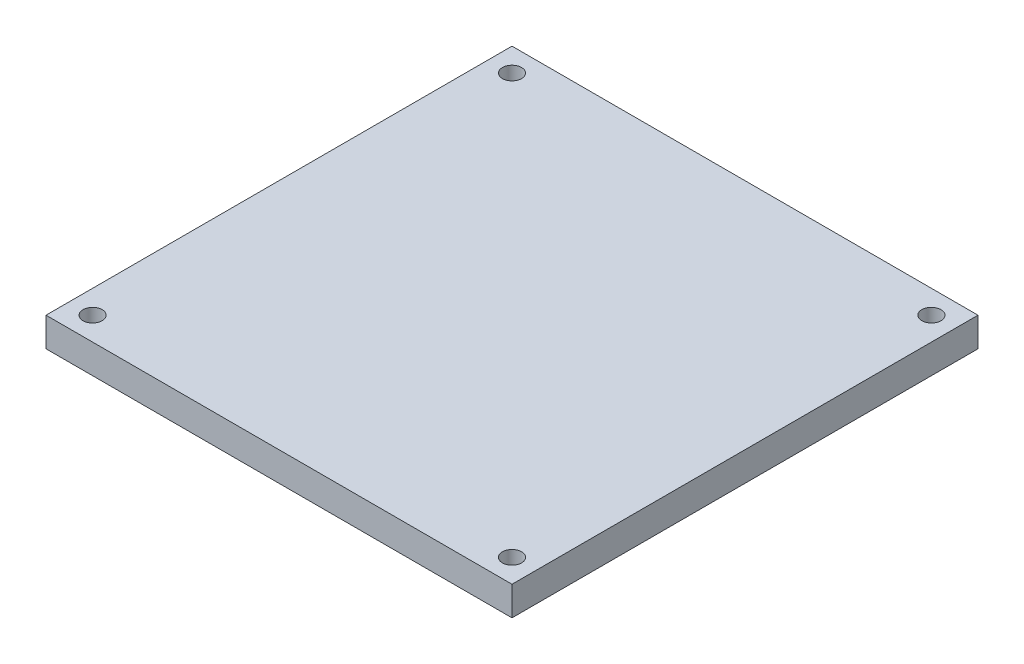
ISO-10303-21;
HEADER;
FILE_DESCRIPTION(('STEP AP214'),'2;1');
FILE_NAME('part.step','',(''),(''),'','','');
FILE_SCHEMA(('AUTOMOTIVE_DESIGN { 1 0 10303 214 1 1 1 1 }'));
ENDSEC;
DATA;
#1=APPLICATION_CONTEXT('core data for automotive mechanical design processes');
#2=APPLICATION_PROTOCOL_DEFINITION('international standard','automotive_design',2000,#1);
#3=PRODUCT_CONTEXT('',#1,'mechanical');
#4=PRODUCT('Part','Part','',(#3));
#5=PRODUCT_RELATED_PRODUCT_CATEGORY('part','',(#4));
#6=PRODUCT_DEFINITION_FORMATION('','',#4);
#7=PRODUCT_DEFINITION_CONTEXT('part definition',#1,'design');
#8=PRODUCT_DEFINITION('design','',#6,#7);
#9=PRODUCT_DEFINITION_SHAPE('','',#8);
#10=(LENGTH_UNIT() NAMED_UNIT(*) SI_UNIT(.MILLI.,.METRE.));
#11=(NAMED_UNIT(*) PLANE_ANGLE_UNIT() SI_UNIT($,.RADIAN.));
#12=(NAMED_UNIT(*) SI_UNIT($,.STERADIAN.) SOLID_ANGLE_UNIT());
#13=UNCERTAINTY_MEASURE_WITH_UNIT(LENGTH_MEASURE(1.E-05),#10,'distance_accuracy_value','');
#14=(GEOMETRIC_REPRESENTATION_CONTEXT(3) GLOBAL_UNCERTAINTY_ASSIGNED_CONTEXT((#13)) GLOBAL_UNIT_ASSIGNED_CONTEXT((#10,
#11,#12)) REPRESENTATION_CONTEXT('',''));
#15=CARTESIAN_POINT('',(0.,0.,0.));
#16=DIRECTION('',(0.,0.,1.));
#17=DIRECTION('',(1.,0.,0.));
#18=AXIS2_PLACEMENT_3D('',#15,#16,#17);
#19=CARTESIAN_POINT('',(-40.,5.,40.));
#20=DIRECTION('',(0.,1.,0.));
#21=DIRECTION('',(0.,0.,1.));
#22=AXIS2_PLACEMENT_3D('',#19,#20,#21);
#23=PLANE('',#22);
#24=CARTESIAN_POINT('',(-36.,5.,36.));
#25=DIRECTION('',(0.,1.,0.));
#26=DIRECTION('',(0.,0.,-1.));
#27=AXIS2_PLACEMENT_3D('',#24,#25,#26);
#28=CIRCLE('',#27,1.65);
#29=CARTESIAN_POINT('',(-36.,5.,34.35));
#30=VERTEX_POINT('',#29);
#31=EDGE_CURVE('E120',#30,#30,#28,.T.);
#32=ORIENTED_EDGE('',*,*,#31,.F.);
#33=EDGE_LOOP('',(#32));
#34=FACE_BOUND('',#33,.T.);
#35=CARTESIAN_POINT('',(-36.,5.,-36.));
#36=DIRECTION('',(0.,1.,0.));
#37=DIRECTION('',(0.,0.,1.));
#38=AXIS2_PLACEMENT_3D('',#35,#36,#37);
#39=CIRCLE('',#38,1.65);
#40=CARTESIAN_POINT('',(-36.,5.,-34.35));
#41=VERTEX_POINT('',#40);
#42=EDGE_CURVE('E99',#41,#41,#39,.T.);
#43=ORIENTED_EDGE('',*,*,#42,.F.);
#44=EDGE_LOOP('',(#43));
#45=FACE_BOUND('',#44,.T.);
#46=DIRECTION('',(0.,0.,1.));
#47=VECTOR('',#46,1.);
#48=CARTESIAN_POINT('',(-40.,5.,-40.));
#49=LINE('',#48,#47);
#50=CARTESIAN_POINT('',(-40.,5.,-40.));
#51=VERTEX_POINT('',#50);
#52=CARTESIAN_POINT('',(-40.,5.,40.));
#53=VERTEX_POINT('',#52);
#54=EDGE_CURVE('E84',#51,#53,#49,.T.);
#55=ORIENTED_EDGE('',*,*,#54,.T.);
#56=DIRECTION('',(1.,0.,0.));
#57=VECTOR('',#56,1.);
#58=CARTESIAN_POINT('',(-40.,5.,40.));
#59=LINE('',#58,#57);
#60=CARTESIAN_POINT('',(40.,5.,40.));
#61=VERTEX_POINT('',#60);
#62=EDGE_CURVE('E79',#53,#61,#59,.T.);
#63=ORIENTED_EDGE('',*,*,#62,.T.);
#64=DIRECTION('',(0.,0.,-1.));
#65=VECTOR('',#64,1.);
#66=CARTESIAN_POINT('',(40.,5.,-40.));
#67=LINE('',#66,#65);
#68=CARTESIAN_POINT('',(40.,5.,-40.));
#69=VERTEX_POINT('',#68);
#70=EDGE_CURVE('E82',#61,#69,#67,.T.);
#71=ORIENTED_EDGE('',*,*,#70,.T.);
#72=DIRECTION('',(-1.,0.,0.));
#73=VECTOR('',#72,1.);
#74=CARTESIAN_POINT('',(-40.,5.,-40.));
#75=LINE('',#74,#73);
#76=EDGE_CURVE('E49',#69,#51,#75,.T.);
#77=ORIENTED_EDGE('',*,*,#76,.T.);
#78=EDGE_LOOP('',(#55,#63,#71,#77));
#79=FACE_BOUND('',#78,.T.);
#80=CARTESIAN_POINT('',(36.,5.,-36.));
#81=DIRECTION('',(0.,1.,0.));
#82=DIRECTION('',(0.,0.,-1.));
#83=AXIS2_PLACEMENT_3D('',#80,#81,#82);
#84=CIRCLE('',#83,1.65);
#85=CARTESIAN_POINT('',(36.,5.,-37.65));
#86=VERTEX_POINT('',#85);
#87=EDGE_CURVE('E114',#86,#86,#84,.T.);
#88=ORIENTED_EDGE('',*,*,#87,.F.);
#89=EDGE_LOOP('',(#88));
#90=FACE_BOUND('',#89,.T.);
#91=CARTESIAN_POINT('',(36.,5.,36.));
#92=DIRECTION('',(0.,1.,0.));
#93=DIRECTION('',(0.,0.,1.));
#94=AXIS2_PLACEMENT_3D('',#91,#92,#93);
#95=CIRCLE('',#94,1.65);
#96=CARTESIAN_POINT('',(36.,5.,37.65));
#97=VERTEX_POINT('',#96);
#98=EDGE_CURVE('E126',#97,#97,#95,.T.);
#99=ORIENTED_EDGE('',*,*,#98,.F.);
#100=EDGE_LOOP('',(#99));
#101=FACE_BOUND('',#100,.T.);
#102=ADVANCED_FACE('F32',(#34,#45,#79,#90,#101),#23,.T.);
#103=CARTESIAN_POINT('',(-40.,0.,40.));
#104=DIRECTION('',(0.,1.,0.));
#105=DIRECTION('',(0.,0.,1.));
#106=AXIS2_PLACEMENT_3D('',#103,#104,#105);
#107=PLANE('',#106);
#108=CARTESIAN_POINT('',(-36.,0.,36.));
#109=DIRECTION('',(0.,1.,0.));
#110=DIRECTION('',(0.,0.,-1.));
#111=AXIS2_PLACEMENT_3D('',#108,#109,#110);
#112=CIRCLE('',#111,1.65);
#113=CARTESIAN_POINT('',(-36.,0.,34.35));
#114=VERTEX_POINT('',#113);
#115=EDGE_CURVE('E123',#114,#114,#112,.T.);
#116=ORIENTED_EDGE('',*,*,#115,.T.);
#117=EDGE_LOOP('',(#116));
#118=FACE_BOUND('',#117,.T.);
#119=CARTESIAN_POINT('',(-36.,0.,-36.));
#120=DIRECTION('',(0.,1.,0.));
#121=DIRECTION('',(0.,0.,1.));
#122=AXIS2_PLACEMENT_3D('',#119,#120,#121);
#123=CIRCLE('',#122,1.65);
#124=CARTESIAN_POINT('',(-36.,0.,-34.35));
#125=VERTEX_POINT('',#124);
#126=EDGE_CURVE('E111',#125,#125,#123,.T.);
#127=ORIENTED_EDGE('',*,*,#126,.T.);
#128=EDGE_LOOP('',(#127));
#129=FACE_BOUND('',#128,.T.);
#130=DIRECTION('',(0.,0.,1.));
#131=VECTOR('',#130,1.);
#132=CARTESIAN_POINT('',(-40.,0.,-40.));
#133=LINE('',#132,#131);
#134=CARTESIAN_POINT('',(-40.,0.,-40.));
#135=VERTEX_POINT('',#134);
#136=CARTESIAN_POINT('',(-40.,0.,40.));
#137=VERTEX_POINT('',#136);
#138=EDGE_CURVE('E96',#135,#137,#133,.T.);
#139=ORIENTED_EDGE('',*,*,#138,.F.);
#140=DIRECTION('',(-1.,0.,0.));
#141=VECTOR('',#140,1.);
#142=CARTESIAN_POINT('',(-40.,0.,-40.));
#143=LINE('',#142,#141);
#144=CARTESIAN_POINT('',(40.,0.,-40.));
#145=VERTEX_POINT('',#144);
#146=EDGE_CURVE('E72',#145,#135,#143,.T.);
#147=ORIENTED_EDGE('',*,*,#146,.F.);
#148=DIRECTION('',(0.,0.,-1.));
#149=VECTOR('',#148,1.);
#150=CARTESIAN_POINT('',(40.,0.,-40.));
#151=LINE('',#150,#149);
#152=CARTESIAN_POINT('',(40.,0.,40.));
#153=VERTEX_POINT('',#152);
#154=EDGE_CURVE('E66',#153,#145,#151,.T.);
#155=ORIENTED_EDGE('',*,*,#154,.F.);
#156=DIRECTION('',(1.,0.,0.));
#157=VECTOR('',#156,1.);
#158=CARTESIAN_POINT('',(-40.,0.,40.));
#159=LINE('',#158,#157);
#160=EDGE_CURVE('E88',#137,#153,#159,.T.);
#161=ORIENTED_EDGE('',*,*,#160,.F.);
#162=EDGE_LOOP('',(#139,#147,#155,#161));
#163=FACE_BOUND('',#162,.T.);
#164=CARTESIAN_POINT('',(36.,0.,-36.));
#165=DIRECTION('',(0.,1.,0.));
#166=DIRECTION('',(0.,0.,-1.));
#167=AXIS2_PLACEMENT_3D('',#164,#165,#166);
#168=CIRCLE('',#167,1.65);
#169=CARTESIAN_POINT('',(36.,0.,-37.65));
#170=VERTEX_POINT('',#169);
#171=EDGE_CURVE('E117',#170,#170,#168,.T.);
#172=ORIENTED_EDGE('',*,*,#171,.T.);
#173=EDGE_LOOP('',(#172));
#174=FACE_BOUND('',#173,.T.);
#175=CARTESIAN_POINT('',(36.,0.,36.));
#176=DIRECTION('',(0.,1.,0.));
#177=DIRECTION('',(0.,0.,1.));
#178=AXIS2_PLACEMENT_3D('',#175,#176,#177);
#179=CIRCLE('',#178,1.65);
#180=CARTESIAN_POINT('',(36.,0.,37.65));
#181=VERTEX_POINT('',#180);
#182=EDGE_CURVE('E129',#181,#181,#179,.T.);
#183=ORIENTED_EDGE('',*,*,#182,.T.);
#184=EDGE_LOOP('',(#183));
#185=FACE_BOUND('',#184,.T.);
#186=ADVANCED_FACE('F107',(#118,#129,#163,#174,#185),#107,.F.);
#187=CARTESIAN_POINT('',(-40.,5.,-40.));
#188=DIRECTION('',(1.,0.,0.));
#189=DIRECTION('',(0.,0.,-1.));
#190=AXIS2_PLACEMENT_3D('',#187,#188,#189);
#191=PLANE('',#190);
#192=ORIENTED_EDGE('',*,*,#138,.T.);
#193=DIRECTION('',(0.,-1.,0.));
#194=VECTOR('',#193,1.);
#195=CARTESIAN_POINT('',(-40.,5.,40.));
#196=LINE('',#195,#194);
#197=EDGE_CURVE('E11',#53,#137,#196,.T.);
#198=ORIENTED_EDGE('',*,*,#197,.F.);
#199=ORIENTED_EDGE('',*,*,#54,.F.);
#200=DIRECTION('',(0.,-1.,0.));
#201=VECTOR('',#200,1.);
#202=CARTESIAN_POINT('',(-40.,5.,-40.));
#203=LINE('',#202,#201);
#204=EDGE_CURVE('E92',#51,#135,#203,.T.);
#205=ORIENTED_EDGE('',*,*,#204,.T.);
#206=EDGE_LOOP('',(#192,#198,#199,#205));
#207=FACE_BOUND('',#206,.T.);
#208=ADVANCED_FACE('F34',(#207),#191,.F.);
#209=CARTESIAN_POINT('',(-40.,5.,40.));
#210=DIRECTION('',(0.,0.,-1.));
#211=DIRECTION('',(-1.,0.,0.));
#212=AXIS2_PLACEMENT_3D('',#209,#210,#211);
#213=PLANE('',#212);
#214=ORIENTED_EDGE('',*,*,#160,.T.);
#215=DIRECTION('',(0.,-1.,0.));
#216=VECTOR('',#215,1.);
#217=CARTESIAN_POINT('',(40.,5.,40.));
#218=LINE('',#217,#216);
#219=EDGE_CURVE('E41',#61,#153,#218,.T.);
#220=ORIENTED_EDGE('',*,*,#219,.F.);
#221=ORIENTED_EDGE('',*,*,#62,.F.);
#222=ORIENTED_EDGE('',*,*,#197,.T.);
#223=EDGE_LOOP('',(#214,#220,#221,#222));
#224=FACE_BOUND('',#223,.T.);
#225=ADVANCED_FACE('F87',(#224),#213,.F.);
#226=CARTESIAN_POINT('',(40.,5.,-40.));
#227=DIRECTION('',(-1.,0.,0.));
#228=DIRECTION('',(0.,0.,1.));
#229=AXIS2_PLACEMENT_3D('',#226,#227,#228);
#230=PLANE('',#229);
#231=ORIENTED_EDGE('',*,*,#154,.T.);
#232=DIRECTION('',(0.,-1.,0.));
#233=VECTOR('',#232,1.);
#234=CARTESIAN_POINT('',(40.,5.,-40.));
#235=LINE('',#234,#233);
#236=EDGE_CURVE('E89',#69,#145,#235,.T.);
#237=ORIENTED_EDGE('',*,*,#236,.F.);
#238=ORIENTED_EDGE('',*,*,#70,.F.);
#239=ORIENTED_EDGE('',*,*,#219,.T.);
#240=EDGE_LOOP('',(#231,#237,#238,#239));
#241=FACE_BOUND('',#240,.T.);
#242=ADVANCED_FACE('F90',(#241),#230,.F.);
#243=CARTESIAN_POINT('',(-40.,5.,-40.));
#244=DIRECTION('',(0.,0.,1.));
#245=DIRECTION('',(1.,0.,0.));
#246=AXIS2_PLACEMENT_3D('',#243,#244,#245);
#247=PLANE('',#246);
#248=ORIENTED_EDGE('',*,*,#146,.T.);
#249=ORIENTED_EDGE('',*,*,#204,.F.);
#250=ORIENTED_EDGE('',*,*,#76,.F.);
#251=ORIENTED_EDGE('',*,*,#236,.T.);
#252=EDGE_LOOP('',(#248,#249,#250,#251));
#253=FACE_BOUND('',#252,.T.);
#254=ADVANCED_FACE('F104',(#253),#247,.F.);
#255=CARTESIAN_POINT('',(-36.,5.,-36.));
#256=DIRECTION('',(0.,-1.,0.));
#257=DIRECTION('',(0.,0.,-1.));
#258=AXIS2_PLACEMENT_3D('',#255,#256,#257);
#259=CYLINDRICAL_SURFACE('',#258,1.65);
#260=ORIENTED_EDGE('',*,*,#42,.T.);
#261=EDGE_LOOP('',(#260));
#262=FACE_BOUND('',#261,.T.);
#263=ORIENTED_EDGE('',*,*,#126,.F.);
#264=EDGE_LOOP('',(#263));
#265=FACE_BOUND('',#264,.T.);
#266=ADVANCED_FACE('F149',(#262,#265),#259,.F.);
#267=CARTESIAN_POINT('',(36.,5.,-36.));
#268=DIRECTION('',(0.,-1.,0.));
#269=DIRECTION('',(0.,0.,-1.));
#270=AXIS2_PLACEMENT_3D('',#267,#268,#269);
#271=CYLINDRICAL_SURFACE('',#270,1.65);
#272=ORIENTED_EDGE('',*,*,#87,.T.);
#273=EDGE_LOOP('',(#272));
#274=FACE_BOUND('',#273,.T.);
#275=ORIENTED_EDGE('',*,*,#171,.F.);
#276=EDGE_LOOP('',(#275));
#277=FACE_BOUND('',#276,.T.);
#278=ADVANCED_FACE('F195',(#274,#277),#271,.F.);
#279=CARTESIAN_POINT('',(-36.,5.,36.));
#280=DIRECTION('',(0.,-1.,0.));
#281=DIRECTION('',(0.,0.,-1.));
#282=AXIS2_PLACEMENT_3D('',#279,#280,#281);
#283=CYLINDRICAL_SURFACE('',#282,1.65);
#284=ORIENTED_EDGE('',*,*,#31,.T.);
#285=EDGE_LOOP('',(#284));
#286=FACE_BOUND('',#285,.T.);
#287=ORIENTED_EDGE('',*,*,#115,.F.);
#288=EDGE_LOOP('',(#287));
#289=FACE_BOUND('',#288,.T.);
#290=ADVANCED_FACE('F203',(#286,#289),#283,.F.);
#291=CARTESIAN_POINT('',(36.,5.,36.));
#292=DIRECTION('',(0.,-1.,0.));
#293=DIRECTION('',(0.,0.,-1.));
#294=AXIS2_PLACEMENT_3D('',#291,#292,#293);
#295=CYLINDRICAL_SURFACE('',#294,1.65);
#296=ORIENTED_EDGE('',*,*,#98,.T.);
#297=EDGE_LOOP('',(#296));
#298=FACE_BOUND('',#297,.T.);
#299=ORIENTED_EDGE('',*,*,#182,.F.);
#300=EDGE_LOOP('',(#299));
#301=FACE_BOUND('',#300,.T.);
#302=ADVANCED_FACE('F135',(#298,#301),#295,.F.);
#303=CLOSED_SHELL('',(#102,#186,#208,#225,#242,#254,#266,#278,#290,#302));
#304=MANIFOLD_SOLID_BREP('B2',#303);
#305=ADVANCED_BREP_SHAPE_REPRESENTATION('',(#18,#304),#14);
#306=SHAPE_DEFINITION_REPRESENTATION(#9,#305);
ENDSEC;
END-ISO-10303-21;
